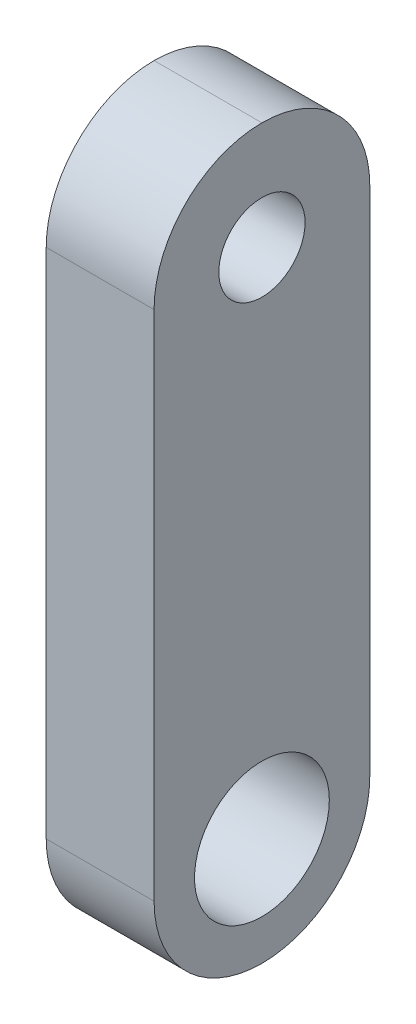
ISO-10303-21;
HEADER;
FILE_DESCRIPTION(('STEP AP214'),'2;1');
FILE_NAME('part.step','',(''),(''),'','','');
FILE_SCHEMA(('AUTOMOTIVE_DESIGN { 1 0 10303 214 1 1 1 1 }'));
ENDSEC;
DATA;
#1=APPLICATION_CONTEXT('core data for automotive mechanical design processes');
#2=APPLICATION_PROTOCOL_DEFINITION('international standard','automotive_design',2000,#1);
#3=PRODUCT_CONTEXT('',#1,'mechanical');
#4=PRODUCT('Part','Part','',(#3));
#5=PRODUCT_RELATED_PRODUCT_CATEGORY('part','',(#4));
#6=PRODUCT_DEFINITION_FORMATION('','',#4);
#7=PRODUCT_DEFINITION_CONTEXT('part definition',#1,'design');
#8=PRODUCT_DEFINITION('design','',#6,#7);
#9=PRODUCT_DEFINITION_SHAPE('','',#8);
#10=(LENGTH_UNIT() NAMED_UNIT(*) SI_UNIT(.MILLI.,.METRE.));
#11=(NAMED_UNIT(*) PLANE_ANGLE_UNIT() SI_UNIT($,.RADIAN.));
#12=(NAMED_UNIT(*) SI_UNIT($,.STERADIAN.) SOLID_ANGLE_UNIT());
#13=UNCERTAINTY_MEASURE_WITH_UNIT(LENGTH_MEASURE(1.E-05),#10,'distance_accuracy_value','');
#14=(GEOMETRIC_REPRESENTATION_CONTEXT(3) GLOBAL_UNCERTAINTY_ASSIGNED_CONTEXT((#13)) GLOBAL_UNIT_ASSIGNED_CONTEXT((#10,
#11,#12)) REPRESENTATION_CONTEXT('',''));
#15=CARTESIAN_POINT('',(0.,0.,0.));
#16=DIRECTION('',(0.,0.,1.));
#17=DIRECTION('',(1.,0.,0.));
#18=AXIS2_PLACEMENT_3D('',#15,#16,#17);
#19=CARTESIAN_POINT('',(4.,0.,0.));
#20=DIRECTION('',(0.,0.,-1.));
#21=DIRECTION('',(0.,1.,0.));
#22=AXIS2_PLACEMENT_3D('',#19,#20,#21);
#23=PLANE('',#22);
#24=DIRECTION('',(0.,-1.,0.));
#25=VECTOR('',#24,1.);
#26=CARTESIAN_POINT('',(0.,0.,0.));
#27=LINE('',#26,#25);
#28=CARTESIAN_POINT('',(0.,-4.,0.));
#29=VERTEX_POINT('',#28);
#30=CARTESIAN_POINT('',(0.,-23.,0.));
#31=VERTEX_POINT('',#30);
#32=EDGE_CURVE('E112',#29,#31,#27,.T.);
#33=ORIENTED_EDGE('',*,*,#32,.T.);
#34=DIRECTION('',(-1.,0.,0.));
#35=VECTOR('',#34,1.);
#36=CARTESIAN_POINT('',(4.,-23.,0.));
#37=LINE('',#36,#35);
#38=CARTESIAN_POINT('',(4.,-23.,0.));
#39=VERTEX_POINT('',#38);
#40=EDGE_CURVE('E11',#31,#39,#37,.F.);
#41=ORIENTED_EDGE('',*,*,#40,.T.);
#42=DIRECTION('',(0.,-1.,0.));
#43=VECTOR('',#42,1.);
#44=CARTESIAN_POINT('',(4.,0.,0.));
#45=LINE('',#44,#43);
#46=CARTESIAN_POINT('',(4.,-4.,0.));
#47=VERTEX_POINT('',#46);
#48=EDGE_CURVE('E111',#47,#39,#45,.T.);
#49=ORIENTED_EDGE('',*,*,#48,.F.);
#50=DIRECTION('',(-1.,0.,0.));
#51=VECTOR('',#50,1.);
#52=CARTESIAN_POINT('',(4.,-4.,0.));
#53=LINE('',#52,#51);
#54=EDGE_CURVE('E42',#47,#29,#53,.T.);
#55=ORIENTED_EDGE('',*,*,#54,.T.);
#56=EDGE_LOOP('',(#33,#41,#49,#55));
#57=FACE_BOUND('',#56,.T.);
#58=ADVANCED_FACE('F33',(#57),#23,.F.);
#59=CARTESIAN_POINT('',(4.,0.,-8.));
#60=DIRECTION('',(0.,0.,1.));
#61=DIRECTION('',(0.,-1.,0.));
#62=AXIS2_PLACEMENT_3D('',#59,#60,#61);
#63=PLANE('',#62);
#64=DIRECTION('',(0.,1.,0.));
#65=VECTOR('',#64,1.);
#66=CARTESIAN_POINT('',(4.,0.,-8.));
#67=LINE('',#66,#65);
#68=CARTESIAN_POINT('',(4.,-23.,-8.));
#69=VERTEX_POINT('',#68);
#70=CARTESIAN_POINT('',(4.,-4.,-8.));
#71=VERTEX_POINT('',#70);
#72=EDGE_CURVE('E105',#69,#71,#67,.T.);
#73=ORIENTED_EDGE('',*,*,#72,.F.);
#74=DIRECTION('',(-1.,0.,0.));
#75=VECTOR('',#74,1.);
#76=CARTESIAN_POINT('',(4.,-23.,-8.));
#77=LINE('',#76,#75);
#78=CARTESIAN_POINT('',(0.,-23.,-8.));
#79=VERTEX_POINT('',#78);
#80=EDGE_CURVE('E92',#69,#79,#77,.T.);
#81=ORIENTED_EDGE('',*,*,#80,.T.);
#82=DIRECTION('',(0.,1.,0.));
#83=VECTOR('',#82,1.);
#84=CARTESIAN_POINT('',(0.,0.,-8.));
#85=LINE('',#84,#83);
#86=CARTESIAN_POINT('',(0.,-4.,-8.));
#87=VERTEX_POINT('',#86);
#88=EDGE_CURVE('E103',#79,#87,#85,.T.);
#89=ORIENTED_EDGE('',*,*,#88,.T.);
#90=DIRECTION('',(-1.,0.,0.));
#91=VECTOR('',#90,1.);
#92=CARTESIAN_POINT('',(4.,-4.,-8.));
#93=LINE('',#92,#91);
#94=EDGE_CURVE('E107',#87,#71,#93,.F.);
#95=ORIENTED_EDGE('',*,*,#94,.T.);
#96=EDGE_LOOP('',(#73,#81,#89,#95));
#97=FACE_BOUND('',#96,.T.);
#98=ADVANCED_FACE('F102',(#97),#63,.F.);
#99=CARTESIAN_POINT('',(4.,0.,0.));
#100=DIRECTION('',(1.,0.,0.));
#101=DIRECTION('',(0.,0.,-1.));
#102=AXIS2_PLACEMENT_3D('',#99,#100,#101);
#103=PLANE('',#102);
#104=CARTESIAN_POINT('',(4.,-4.,-4.));
#105=DIRECTION('',(1.,0.,0.));
#106=DIRECTION('',(0.,0.,-1.));
#107=AXIS2_PLACEMENT_3D('',#104,#105,#106);
#108=CIRCLE('',#107,1.6);
#109=CARTESIAN_POINT('',(4.,-4.,-5.6));
#110=VERTEX_POINT('',#109);
#111=EDGE_CURVE('E132',#110,#110,#108,.T.);
#112=ORIENTED_EDGE('',*,*,#111,.F.);
#113=EDGE_LOOP('',(#112));
#114=FACE_BOUND('',#113,.T.);
#115=CARTESIAN_POINT('',(4.,-23.,-4.));
#116=DIRECTION('',(1.,0.,0.));
#117=DIRECTION('',(0.,0.,-1.));
#118=AXIS2_PLACEMENT_3D('',#115,#116,#117);
#119=CIRCLE('',#118,2.5);
#120=CARTESIAN_POINT('',(4.,-23.,-6.5));
#121=VERTEX_POINT('',#120);
#122=EDGE_CURVE('E144',#121,#121,#119,.T.);
#123=ORIENTED_EDGE('',*,*,#122,.F.);
#124=EDGE_LOOP('',(#123));
#125=FACE_BOUND('',#124,.T.);
#126=CARTESIAN_POINT('',(4.,-23.,-4.));
#127=DIRECTION('',(1.,0.,0.));
#128=DIRECTION('',(0.,0.,-1.));
#129=AXIS2_PLACEMENT_3D('',#126,#127,#128);
#130=CIRCLE('',#129,4.);
#131=CARTESIAN_POINT('',(4.,-27.,-4.));
#132=VERTEX_POINT('',#131);
#133=EDGE_CURVE('E57',#39,#132,#130,.T.);
#134=ORIENTED_EDGE('',*,*,#133,.T.);
#135=CARTESIAN_POINT('',(4.,-23.,-4.));
#136=DIRECTION('',(1.,0.,0.));
#137=DIRECTION('',(0.,0.,-1.));
#138=AXIS2_PLACEMENT_3D('',#135,#136,#137);
#139=CIRCLE('',#138,4.);
#140=EDGE_CURVE('E129',#132,#69,#139,.T.);
#141=ORIENTED_EDGE('',*,*,#140,.T.);
#142=ORIENTED_EDGE('',*,*,#72,.T.);
#143=CARTESIAN_POINT('',(4.,-4.,-4.));
#144=DIRECTION('',(1.,0.,0.));
#145=DIRECTION('',(0.,0.,-1.));
#146=AXIS2_PLACEMENT_3D('',#143,#144,#145);
#147=CIRCLE('',#146,4.);
#148=CARTESIAN_POINT('',(4.,0.,-4.));
#149=VERTEX_POINT('',#148);
#150=EDGE_CURVE('E50',#71,#149,#147,.T.);
#151=ORIENTED_EDGE('',*,*,#150,.T.);
#152=CARTESIAN_POINT('',(4.,-4.,-4.));
#153=DIRECTION('',(1.,0.,0.));
#154=DIRECTION('',(0.,0.,-1.));
#155=AXIS2_PLACEMENT_3D('',#152,#153,#154);
#156=CIRCLE('',#155,4.);
#157=EDGE_CURVE('E126',#149,#47,#156,.T.);
#158=ORIENTED_EDGE('',*,*,#157,.T.);
#159=ORIENTED_EDGE('',*,*,#48,.T.);
#160=EDGE_LOOP('',(#134,#141,#142,#151,#158,#159));
#161=FACE_BOUND('',#160,.T.);
#162=ADVANCED_FACE('F142',(#114,#125,#161),#103,.T.);
#163=CARTESIAN_POINT('',(0.,0.,0.));
#164=DIRECTION('',(1.,0.,0.));
#165=DIRECTION('',(0.,0.,-1.));
#166=AXIS2_PLACEMENT_3D('',#163,#164,#165);
#167=PLANE('',#166);
#168=CARTESIAN_POINT('',(0.,-4.,-4.));
#169=DIRECTION('',(1.,0.,0.));
#170=DIRECTION('',(0.,0.,-1.));
#171=AXIS2_PLACEMENT_3D('',#168,#169,#170);
#172=CIRCLE('',#171,1.6);
#173=CARTESIAN_POINT('',(0.,-4.,-5.6));
#174=VERTEX_POINT('',#173);
#175=EDGE_CURVE('E134',#174,#174,#172,.T.);
#176=ORIENTED_EDGE('',*,*,#175,.T.);
#177=EDGE_LOOP('',(#176));
#178=FACE_BOUND('',#177,.T.);
#179=CARTESIAN_POINT('',(0.,-23.,-4.));
#180=DIRECTION('',(1.,0.,0.));
#181=DIRECTION('',(0.,0.,-1.));
#182=AXIS2_PLACEMENT_3D('',#179,#180,#181);
#183=CIRCLE('',#182,2.5);
#184=CARTESIAN_POINT('',(0.,-23.,-6.5));
#185=VERTEX_POINT('',#184);
#186=EDGE_CURVE('E116',#185,#185,#183,.T.);
#187=ORIENTED_EDGE('',*,*,#186,.T.);
#188=EDGE_LOOP('',(#187));
#189=FACE_BOUND('',#188,.T.);
#190=ORIENTED_EDGE('',*,*,#88,.F.);
#191=CARTESIAN_POINT('',(0.,-23.,-4.));
#192=DIRECTION('',(1.,0.,0.));
#193=DIRECTION('',(0.,0.,-1.));
#194=AXIS2_PLACEMENT_3D('',#191,#192,#193);
#195=CIRCLE('',#194,4.);
#196=CARTESIAN_POINT('',(0.,-27.,-4.));
#197=VERTEX_POINT('',#196);
#198=EDGE_CURVE('E88',#79,#197,#195,.F.);
#199=ORIENTED_EDGE('',*,*,#198,.T.);
#200=CARTESIAN_POINT('',(0.,-23.,-4.));
#201=DIRECTION('',(1.,0.,0.));
#202=DIRECTION('',(0.,0.,-1.));
#203=AXIS2_PLACEMENT_3D('',#200,#201,#202);
#204=CIRCLE('',#203,4.);
#205=EDGE_CURVE('E97',#197,#31,#204,.F.);
#206=ORIENTED_EDGE('',*,*,#205,.T.);
#207=ORIENTED_EDGE('',*,*,#32,.F.);
#208=CARTESIAN_POINT('',(0.,-4.,-4.));
#209=DIRECTION('',(1.,0.,0.));
#210=DIRECTION('',(0.,0.,-1.));
#211=AXIS2_PLACEMENT_3D('',#208,#209,#210);
#212=CIRCLE('',#211,4.);
#213=CARTESIAN_POINT('',(0.,0.,-4.));
#214=VERTEX_POINT('',#213);
#215=EDGE_CURVE('E122',#29,#214,#212,.F.);
#216=ORIENTED_EDGE('',*,*,#215,.T.);
#217=CARTESIAN_POINT('',(0.,-4.,-4.));
#218=DIRECTION('',(1.,0.,0.));
#219=DIRECTION('',(0.,0.,-1.));
#220=AXIS2_PLACEMENT_3D('',#217,#218,#219);
#221=CIRCLE('',#220,4.);
#222=EDGE_CURVE('E106',#214,#87,#221,.F.);
#223=ORIENTED_EDGE('',*,*,#222,.T.);
#224=EDGE_LOOP('',(#190,#199,#206,#207,#216,#223));
#225=FACE_BOUND('',#224,.T.);
#226=ADVANCED_FACE('F109',(#178,#189,#225),#167,.F.);
#227=CARTESIAN_POINT('',(0.,-23.,-4.));
#228=DIRECTION('',(1.,0.,0.));
#229=DIRECTION('',(0.,0.,-1.));
#230=AXIS2_PLACEMENT_3D('',#227,#228,#229);
#231=CYLINDRICAL_SURFACE('',#230,2.5);
#232=ORIENTED_EDGE('',*,*,#186,.F.);
#233=EDGE_LOOP('',(#232));
#234=FACE_BOUND('',#233,.T.);
#235=ORIENTED_EDGE('',*,*,#122,.T.);
#236=EDGE_LOOP('',(#235));
#237=FACE_BOUND('',#236,.T.);
#238=ADVANCED_FACE('F158',(#234,#237),#231,.F.);
#239=CARTESIAN_POINT('',(0.,-4.,-4.));
#240=DIRECTION('',(1.,0.,0.));
#241=DIRECTION('',(0.,0.,-1.));
#242=AXIS2_PLACEMENT_3D('',#239,#240,#241);
#243=CYLINDRICAL_SURFACE('',#242,1.6);
#244=ORIENTED_EDGE('',*,*,#175,.F.);
#245=EDGE_LOOP('',(#244));
#246=FACE_BOUND('',#245,.T.);
#247=ORIENTED_EDGE('',*,*,#111,.T.);
#248=EDGE_LOOP('',(#247));
#249=FACE_BOUND('',#248,.T.);
#250=ADVANCED_FACE('F154',(#246,#249),#243,.F.);
#251=CARTESIAN_POINT('',(4.,-23.,-4.));
#252=DIRECTION('',(-1.,0.,0.));
#253=DIRECTION('',(0.,0.,1.));
#254=AXIS2_PLACEMENT_3D('',#251,#252,#253);
#255=CYLINDRICAL_SURFACE('',#254,4.);
#256=DIRECTION('',(-1.,0.,0.));
#257=VECTOR('',#256,1.);
#258=CARTESIAN_POINT('',(4.,-27.,-4.));
#259=LINE('',#258,#257);
#260=EDGE_CURVE('E93',#132,#197,#259,.T.);
#261=ORIENTED_EDGE('',*,*,#260,.F.);
#262=ORIENTED_EDGE('',*,*,#133,.F.);
#263=ORIENTED_EDGE('',*,*,#40,.F.);
#264=ORIENTED_EDGE('',*,*,#205,.F.);
#265=EDGE_LOOP('',(#261,#262,#263,#264));
#266=FACE_BOUND('',#265,.T.);
#267=ADVANCED_FACE('F157',(#266),#255,.T.);
#268=CARTESIAN_POINT('',(4.,-23.,-4.));
#269=DIRECTION('',(-1.,0.,0.));
#270=DIRECTION('',(0.,0.,1.));
#271=AXIS2_PLACEMENT_3D('',#268,#269,#270);
#272=CYLINDRICAL_SURFACE('',#271,4.);
#273=ORIENTED_EDGE('',*,*,#140,.F.);
#274=ORIENTED_EDGE('',*,*,#260,.T.);
#275=ORIENTED_EDGE('',*,*,#198,.F.);
#276=ORIENTED_EDGE('',*,*,#80,.F.);
#277=EDGE_LOOP('',(#273,#274,#275,#276));
#278=FACE_BOUND('',#277,.T.);
#279=ADVANCED_FACE('F91',(#278),#272,.T.);
#280=CARTESIAN_POINT('',(4.,-4.,-4.));
#281=DIRECTION('',(-1.,0.,0.));
#282=DIRECTION('',(0.,0.,1.));
#283=AXIS2_PLACEMENT_3D('',#280,#281,#282);
#284=CYLINDRICAL_SURFACE('',#283,4.);
#285=DIRECTION('',(-1.,0.,0.));
#286=VECTOR('',#285,1.);
#287=CARTESIAN_POINT('',(4.,0.,-4.));
#288=LINE('',#287,#286);
#289=EDGE_CURVE('E37',#149,#214,#288,.T.);
#290=ORIENTED_EDGE('',*,*,#289,.F.);
#291=ORIENTED_EDGE('',*,*,#150,.F.);
#292=ORIENTED_EDGE('',*,*,#94,.F.);
#293=ORIENTED_EDGE('',*,*,#222,.F.);
#294=EDGE_LOOP('',(#290,#291,#292,#293));
#295=FACE_BOUND('',#294,.T.);
#296=ADVANCED_FACE('F35',(#295),#284,.T.);
#297=CARTESIAN_POINT('',(4.,-4.,-4.));
#298=DIRECTION('',(-1.,0.,0.));
#299=DIRECTION('',(0.,0.,1.));
#300=AXIS2_PLACEMENT_3D('',#297,#298,#299);
#301=CYLINDRICAL_SURFACE('',#300,4.);
#302=ORIENTED_EDGE('',*,*,#157,.F.);
#303=ORIENTED_EDGE('',*,*,#289,.T.);
#304=ORIENTED_EDGE('',*,*,#215,.F.);
#305=ORIENTED_EDGE('',*,*,#54,.F.);
#306=EDGE_LOOP('',(#302,#303,#304,#305));
#307=FACE_BOUND('',#306,.T.);
#308=ADVANCED_FACE('F139',(#307),#301,.T.);
#309=CLOSED_SHELL('',(#58,#98,#162,#226,#238,#250,#267,#279,#296,#308));
#310=MANIFOLD_SOLID_BREP('B2',#309);
#311=ADVANCED_BREP_SHAPE_REPRESENTATION('',(#18,#310),#14);
#312=SHAPE_DEFINITION_REPRESENTATION(#9,#311);
ENDSEC;
END-ISO-10303-21;
